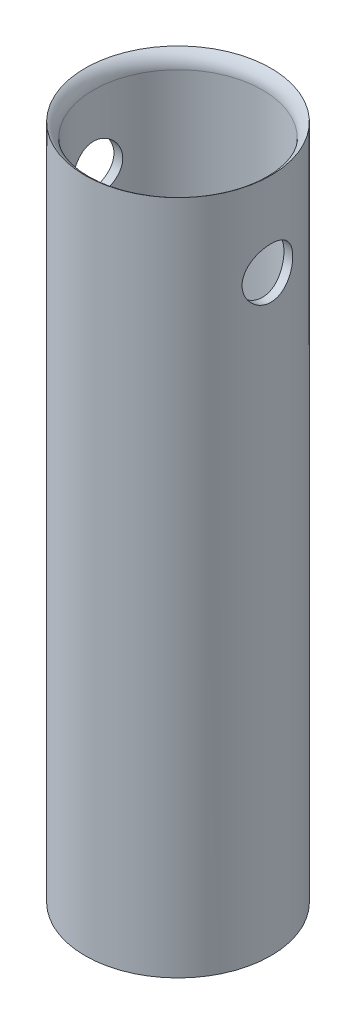
ISO-10303-21;
HEADER;
FILE_DESCRIPTION(('STEP AP214'),'2;1');
FILE_NAME('part.step','',(''),(''),'','','');
FILE_SCHEMA(('AUTOMOTIVE_DESIGN { 1 0 10303 214 1 1 1 1 }'));
ENDSEC;
DATA;
#1=APPLICATION_CONTEXT('core data for automotive mechanical design processes');
#2=APPLICATION_PROTOCOL_DEFINITION('international standard','automotive_design',2000,#1);
#3=PRODUCT_CONTEXT('',#1,'mechanical');
#4=PRODUCT('Part','Part','',(#3));
#5=PRODUCT_RELATED_PRODUCT_CATEGORY('part','',(#4));
#6=PRODUCT_DEFINITION_FORMATION('','',#4);
#7=PRODUCT_DEFINITION_CONTEXT('part definition',#1,'design');
#8=PRODUCT_DEFINITION('design','',#6,#7);
#9=PRODUCT_DEFINITION_SHAPE('','',#8);
#10=(LENGTH_UNIT() NAMED_UNIT(*) SI_UNIT(.MILLI.,.METRE.));
#11=(NAMED_UNIT(*) PLANE_ANGLE_UNIT() SI_UNIT($,.RADIAN.));
#12=(NAMED_UNIT(*) SI_UNIT($,.STERADIAN.) SOLID_ANGLE_UNIT());
#13=UNCERTAINTY_MEASURE_WITH_UNIT(LENGTH_MEASURE(1.E-05),#10,'distance_accuracy_value','');
#14=(GEOMETRIC_REPRESENTATION_CONTEXT(3) GLOBAL_UNCERTAINTY_ASSIGNED_CONTEXT((#13)) GLOBAL_UNIT_ASSIGNED_CONTEXT((#10,
#11,#12)) REPRESENTATION_CONTEXT('',''));
#15=CARTESIAN_POINT('',(0.,0.,0.));
#16=DIRECTION('',(0.,0.,1.));
#17=DIRECTION('',(1.,0.,0.));
#18=AXIS2_PLACEMENT_3D('',#15,#16,#17);
#19=CARTESIAN_POINT('',(0.,40.,0.));
#20=DIRECTION('',(0.,-1.,0.));
#21=DIRECTION('',(0.,0.,-1.));
#22=AXIS2_PLACEMENT_3D('',#19,#20,#21);
#23=CYLINDRICAL_SURFACE('',#22,5.5);
#24=CARTESIAN_POINT('',(-5.5,33.5,0.));
#25=CARTESIAN_POINT('',(-5.49999882717412,33.500001812611,-0.0826209133321938));
#26=CARTESIAN_POINT('',(-5.49812007260761,33.5068490635834,-0.165260978812708));
#27=CARTESIAN_POINT('',(-5.49080798085451,33.5340058303032,-0.328155930157698));
#28=CARTESIAN_POINT('',(-5.48537304740499,33.5543213916286,-0.408409727977266));
#29=CARTESIAN_POINT('',(-5.47154772174135,33.6077017317384,-0.564157626055395));
#30=CARTESIAN_POINT('',(-5.46316123869395,33.6407496526619,-0.639657866970164));
#31=CARTESIAN_POINT('',(-5.44431654412848,33.7185929326624,-0.78404449615972));
#32=CARTESIAN_POINT('',(-5.43385816956517,33.7633892163539,-0.852930363289778));
#33=CARTESIAN_POINT('',(-5.41171397042059,33.8645998364673,-0.983796947573262));
#34=CARTESIAN_POINT('',(-5.4000064149043,33.9212454408542,-1.04559512916994));
#35=CARTESIAN_POINT('',(-5.37682112935063,34.0440526360299,-1.15894293682478));
#36=CARTESIAN_POINT('',(-5.36534343055203,34.1102155104023,-1.21049117824722));
#37=CARTESIAN_POINT('',(-5.34369384163659,34.2516512475795,-1.30277794539498));
#38=CARTESIAN_POINT('',(-5.33354930058623,34.3270671449363,-1.34330426837587));
#39=CARTESIAN_POINT('',(-5.31603507411917,34.4839638281994,-1.41102916361227));
#40=CARTESIAN_POINT('',(-5.30866485085754,34.5654434348885,-1.43823031946844));
#41=CARTESIAN_POINT('',(-5.2977584719274,34.7301278950125,-1.47789456441268));
#42=CARTESIAN_POINT('',(-5.29413612283787,34.8132469481619,-1.49068960543229));
#43=CARTESIAN_POINT('',(-5.29087829084083,34.9805246830088,-1.50221364409134));
#44=CARTESIAN_POINT('',(-5.2912420257326,35.0646831575,-1.50094540140882));
#45=CARTESIAN_POINT('',(-5.29583824875455,35.2290415509663,-1.48464191780301));
#46=CARTESIAN_POINT('',(-5.29995718313671,35.3092852346022,-1.47001073668932));
#47=CARTESIAN_POINT('',(-5.31141755794059,35.4661332860228,-1.42804483871807));
#48=CARTESIAN_POINT('',(-5.31875926644153,35.5427373504663,-1.40070906504647));
#49=CARTESIAN_POINT('',(-5.33593618292326,35.6911735205475,-1.3337862982647));
#50=CARTESIAN_POINT('',(-5.34579959764141,35.7629392010336,-1.29405951882947));
#51=CARTESIAN_POINT('',(-5.36689368797792,35.8989264474097,-1.20357988022174));
#52=CARTESIAN_POINT('',(-5.37812464363249,35.9631464628388,-1.15282476106209));
#53=CARTESIAN_POINT('',(-5.40115894990605,36.0845251898064,-1.03967346682896));
#54=CARTESIAN_POINT('',(-5.41296874297114,36.1413674492889,-0.976938646167248));
#55=CARTESIAN_POINT('',(-5.43548647707979,36.2437909649778,-0.842682011788634));
#56=CARTESIAN_POINT('',(-5.44619437064292,36.2893717360496,-0.771159819718553));
#57=CARTESIAN_POINT('',(-5.46537278121261,36.3681266727749,-0.620853953739625));
#58=CARTESIAN_POINT('',(-5.47383251287305,36.401241338584,-0.542037637417774));
#59=CARTESIAN_POINT('',(-5.48748356142612,36.4536579725141,-0.379672688714391));
#60=CARTESIAN_POINT('',(-5.49267562644564,36.4729631024441,-0.296125144317683));
#61=CARTESIAN_POINT('',(-5.49909228776313,36.496710617797,-0.129368170483251));
#62=CARTESIAN_POINT('',(-5.50043163125371,36.5015829953204,-0.0462242977839799));
#63=CARTESIAN_POINT('',(-5.49932301585136,36.4975172524866,0.119693365637973));
#64=CARTESIAN_POINT('',(-5.49687546782998,36.4885806303835,0.202467195532508));
#65=CARTESIAN_POINT('',(-5.48854239265957,36.4575024972969,0.363745097739557));
#66=CARTESIAN_POINT('',(-5.48271986472129,36.435602807243,0.442299324272677));
#67=CARTESIAN_POINT('',(-5.46829923535645,36.3795027553595,0.594609867448631));
#68=CARTESIAN_POINT('',(-5.45970082634473,36.3453010303387,0.668365651304997));
#69=CARTESIAN_POINT('',(-5.44041573828275,36.2647835577143,0.810641161194591));
#70=CARTESIAN_POINT('',(-5.4296902954988,36.2182365127385,0.879024602412584));
#71=CARTESIAN_POINT('',(-5.40738988410034,36.1146387124548,1.00716022013082));
#72=CARTESIAN_POINT('',(-5.39581474001048,36.0575857838425,1.06691060617763));
#73=CARTESIAN_POINT('',(-5.37269401558495,35.9325859619651,1.17791060344313));
#74=CARTESIAN_POINT('',(-5.36115944983885,35.864366617721,1.22885627747222));
#75=CARTESIAN_POINT('',(-5.33980026187814,35.7201013527808,1.3185858220796));
#76=CARTESIAN_POINT('',(-5.32997557125461,35.6440557453925,1.35737017925923));
#77=CARTESIAN_POINT('',(-5.31326248703816,35.486659371758,1.42138558317209));
#78=CARTESIAN_POINT('',(-5.30635748202252,35.4053417394748,1.44669352306985));
#79=CARTESIAN_POINT('',(-5.29626814696188,35.2393831619724,1.48320917220692));
#80=CARTESIAN_POINT('',(-5.29308281231875,35.1547431204463,1.49442068863148));
#81=CARTESIAN_POINT('',(-5.29088009671763,34.9876615961825,1.50219895576908));
#82=CARTESIAN_POINT('',(-5.29172336001588,34.9052444112775,1.49925533217026));
#83=CARTESIAN_POINT('',(-5.29715501736986,34.742129352265,1.47994837643976));
#84=CARTESIAN_POINT('',(-5.30174330649891,34.661431430053,1.46358542028567));
#85=CARTESIAN_POINT('',(-5.31406316491799,34.5046936842239,1.41819408435119));
#86=CARTESIAN_POINT('',(-5.32176783125817,34.4286202467582,1.38927395449127));
#87=CARTESIAN_POINT('',(-5.33945189987964,34.2823467231867,1.31967304541385));
#88=CARTESIAN_POINT('',(-5.34943167369227,34.2121475989348,1.27899034504456));
#89=CARTESIAN_POINT('',(-5.37092379381814,34.0772894023074,1.18555430984851));
#90=CARTESIAN_POINT('',(-5.38247375845259,34.0128662951569,1.13246901822125));
#91=CARTESIAN_POINT('',(-5.40559990490855,33.8936835932054,1.01636011199274));
#92=CARTESIAN_POINT('',(-5.41717609247304,33.8389263759947,0.953334059387992));
#93=CARTESIAN_POINT('',(-5.43936459177359,33.7394053854806,0.817407725686076));
#94=CARTESIAN_POINT('',(-5.44994907753807,33.694896519133,0.744315866262518));
#95=CARTESIAN_POINT('',(-5.46865263780403,33.6188675637885,0.591399899839278));
#96=CARTESIAN_POINT('',(-5.47677322151197,33.5873395194457,0.511579952421219));
#97=CARTESIAN_POINT('',(-5.48864193995757,33.542060490021,0.360100101218209));
#98=CARTESIAN_POINT('',(-5.49286947681091,33.5263254487583,0.289064640262467));
#99=CARTESIAN_POINT('',(-5.49854887164354,33.5052949746812,0.145357607941483));
#100=CARTESIAN_POINT('',(-5.5000010318002,33.4999984053452,0.0726862155649465));
#101=CARTESIAN_POINT('',(-5.5,33.5,0.));
#102=B_SPLINE_CURVE_WITH_KNOTS('',3,(#24,#25,#26,#27,#28,#29,#30,#31,#32,#33,#34,#35,#36,#37,
#38,#39,#40,#41,#42,#43,#44,#45,#46,#47,#48,#49,#50,#51,#52,#53,#54,#55,#56,#57,#58,#59,#60,#61,
#62,#63,#64,#65,#66,#67,#68,#69,#70,#71,#72,#73,#74,#75,#76,#77,#78,#79,#80,#81,#82,#83,#84,#85,
#86,#87,#88,#89,#90,#91,#92,#93,#94,#95,#96,#97,#98,#99,#100,#101),.UNSPECIFIED.,.T.,.F.,(4,2,2,
2,2,2,2,2,2,2,2,2,2,2,2,2,2,2,2,2,2,2,2,2,2,2,2,2,2,2,2,2,2,2,2,2,2,2,4),(0.,0.247596106854898,
0.495303428551301,0.742683902420579,0.990083851364708,1.24285878223179,1.49566783659324,
1.75304593650219,2.01037411390996,2.26164304860926,2.51286267696538,2.75672886674887,
3.00061534583718,3.24735926767928,3.49415380139122,3.74938528550775,4.00462776284424,
4.26107349736029,4.51746049766944,4.76612811343083,5.01476875105251,5.25891111200195,
5.50308053475837,5.75219469009681,6.00136043656004,6.2579007306487,6.51443075867912,
6.76948096455405,7.02446227124211,7.27068852228631,7.51690787489589,7.76104555655818,
8.00522313517587,8.25689011392092,8.50861891104975,8.76605872289059,9.02334052607437,
9.2411883209319,9.45901239561305),.UNSPECIFIED.);
#103=CARTESIAN_POINT('',(-5.5,33.5,0.));
#104=VERTEX_POINT('',#103);
#105=EDGE_CURVE('E85',#104,#104,#102,.T.);
#106=ORIENTED_EDGE('',*,*,#105,.T.);
#107=EDGE_LOOP('',(#106));
#108=FACE_BOUND('',#107,.T.);
#109=CARTESIAN_POINT('',(5.29150262212918,35.,-1.5));
#110=CARTESIAN_POINT('',(5.29150397933242,34.9174435489723,-1.4999981569703));
#111=CARTESIAN_POINT('',(5.29345578048323,34.8348678900445,-1.49316121586719));
#112=CARTESIAN_POINT('',(5.3010274190552,34.6721064747,-1.46604910592423));
#113=CARTESIAN_POINT('',(5.30664898703923,34.5919218645015,-1.44576759691971));
#114=CARTESIAN_POINT('',(5.32087717395131,34.4363208120382,-1.39248674622751));
#115=CARTESIAN_POINT('',(5.32947946238205,34.3608976390958,-1.35950584697685));
#116=CARTESIAN_POINT('',(5.34869425130277,34.2166418657633,-1.28182074023251));
#117=CARTESIAN_POINT('',(5.35930693404948,34.1478098637627,-1.23711546969878));
#118=CARTESIAN_POINT('',(5.38165786345274,34.0168897932087,-1.13599985857016));
#119=CARTESIAN_POINT('',(5.39341679089298,33.954999671622,-1.07933774218464));
#120=CARTESIAN_POINT('',(5.41655710292429,33.8414723422745,-0.956458027204654));
#121=CARTESIAN_POINT('',(5.4279384467319,33.789836239084,-0.890239400501257));
#122=CARTESIAN_POINT('',(5.44927272086847,33.6974513731895,-0.748747592415014));
#123=CARTESIAN_POINT('',(5.45919841481043,33.6569002781736,-0.673340883118101));
#124=CARTESIAN_POINT('',(5.4762652255866,33.5891271318171,-0.516463712056493));
#125=CARTESIAN_POINT('',(5.48340683437022,33.5619027254258,-0.434994324603005));
#126=CARTESIAN_POINT('',(5.49395456075485,33.5221989017195,-0.270371451848025));
#127=CARTESIAN_POINT('',(5.4974458959785,33.5093825557853,-0.187304783419293));
#128=CARTESIAN_POINT('',(5.50059802264474,33.497797697702,-0.0201318714747487));
#129=CARTESIAN_POINT('',(5.50025948354,33.4990267304555,0.0639741877907305));
#130=CARTESIAN_POINT('',(5.49585206403333,33.5152623986484,0.228490060702588));
#131=CARTESIAN_POINT('',(5.49188178563756,33.5299048733193,0.308938859429588));
#132=CARTESIAN_POINT('',(5.48077394096948,33.5719623323456,0.466191004896714));
#133=CARTESIAN_POINT('',(5.47363619004791,33.5993780613283,0.542994138822177));
#134=CARTESIAN_POINT('',(5.45685088879515,33.666477135843,0.691693236894895));
#135=CARTESIAN_POINT('',(5.44717834180867,33.7062834486877,0.763530775491582));
#136=CARTESIAN_POINT('',(5.4263628785745,33.7969388942674,0.899629268660998));
#137=CARTESIAN_POINT('',(5.41521966459728,33.8477902643713,0.963888684077534));
#138=CARTESIAN_POINT('',(5.39224620796906,33.9610179951209,1.08518074875882));
#139=CARTESIAN_POINT('',(5.38040539296798,34.0237116719408,1.14191553261874));
#140=CARTESIAN_POINT('',(5.35769198772825,34.1578452151133,1.24414076282169));
#141=CARTESIAN_POINT('',(5.34681946230361,34.2292856661864,1.28963045681796));
#142=CARTESIAN_POINT('',(5.32722971617593,34.3795543940004,1.36831504906637));
#143=CARTESIAN_POINT('',(5.31852743967169,34.4584290057742,1.40142544272702));
#144=CARTESIAN_POINT('',(5.30444735453973,34.6209226022291,1.45381649809065));
#145=CARTESIAN_POINT('',(5.29906867769276,34.7045403416328,1.47310077178258));
#146=CARTESIAN_POINT('',(5.29243075183376,34.87135218151,1.49677126460125));
#147=CARTESIAN_POINT('',(5.29104827888985,34.9544781867641,1.50160329063472));
#148=CARTESIAN_POINT('',(5.29222151202243,35.1203511435421,1.49746332611022));
#149=CARTESIAN_POINT('',(5.29477677694071,35.2030981364863,1.48849288189024));
#150=CARTESIAN_POINT('',(5.30341820279288,35.3641224373114,1.45739637961775));
#151=CARTESIAN_POINT('',(5.3094315020934,35.4424564206298,1.43554156609381));
#152=CARTESIAN_POINT('',(5.32423951436502,35.5943460099306,1.37960331838531));
#153=CARTESIAN_POINT('',(5.33303460273288,35.6679009693777,1.34551823366713));
#154=CARTESIAN_POINT('',(5.3526656797527,35.810000708167,1.26519240779034));
#155=CARTESIAN_POINT('',(5.36354371589181,35.878392574505,1.21869167395158));
#156=CARTESIAN_POINT('',(5.3860176273416,36.0065660653851,1.11517441622706));
#157=CARTESIAN_POINT('',(5.39761364372337,36.0663459901001,1.05815582137422));
#158=CARTESIAN_POINT('',(5.42064365021152,36.1774663639506,0.933153363001186));
#159=CARTESIAN_POINT('',(5.43206199790196,36.2284950034342,0.8648888475196));
#160=CARTESIAN_POINT('',(5.45308956662174,36.318370635091,0.720505557506887));
#161=CARTESIAN_POINT('',(5.46269888388575,36.3572182753278,0.644387201108798));
#162=CARTESIAN_POINT('',(5.47896373225224,36.4212670662579,0.486992338151911));
#163=CARTESIAN_POINT('',(5.48564141597945,36.4465708903005,0.405760013245425));
#164=CARTESIAN_POINT('',(5.49538823820121,36.4831069525451,0.239985864722819));
#165=CARTESIAN_POINT('',(5.4984582160406,36.4943424638269,0.155444815623817));
#166=CARTESIAN_POINT('',(5.50060207356917,36.5022101200906,-0.0116397196820228));
#167=CARTESIAN_POINT('',(5.49980084994582,36.4992986713067,-0.094160409305192));
#168=CARTESIAN_POINT('',(5.4945768528746,36.48002022269,-0.257491304637166));
#169=CARTESIAN_POINT('',(5.49015422670854,36.4636537700697,-0.338301579771118));
#170=CARTESIAN_POINT('',(5.47821112917835,36.4181926296605,-0.49534203369685));
#171=CARTESIAN_POINT('',(5.47071413494114,36.3891943017598,-0.571602011794993));
#172=CARTESIAN_POINT('',(5.45340440920124,36.3193783784649,-0.718217369622537));
#173=CARTESIAN_POINT('',(5.44359134174256,36.2785590681934,-0.788571890732096));
#174=CARTESIAN_POINT('',(5.42235787347661,36.1849452717183,-0.923488675195431));
#175=CARTESIAN_POINT('',(5.41090053751388,36.1318509275634,-0.987837043212874));
#176=CARTESIAN_POINT('',(5.38781343748961,36.0157578614498,-1.10686496193089));
#177=CARTESIAN_POINT('',(5.37618362817694,35.9527564970487,-1.16154192474211));
#178=CARTESIAN_POINT('',(5.35375507792812,35.8168724731691,-1.2609396606189));
#179=CARTESIAN_POINT('',(5.34298201162846,35.7437937973192,-1.30539879787935));
#180=CARTESIAN_POINT('',(5.32385655741428,35.5909140548504,-1.38133806303029));
#181=CARTESIAN_POINT('',(5.31550265682104,35.5111172294897,-1.41282630671052));
#182=CARTESIAN_POINT('',(5.30326481572331,35.3597319807474,-1.45802611152119));
#183=CARTESIAN_POINT('',(5.29889066810921,35.2887715312485,-1.47372831222931));
#184=CARTESIAN_POINT('',(5.29300915582115,35.1452122020973,-1.494715407894));
#185=CARTESIAN_POINT('',(5.29150142838456,35.0726135309487,-1.5000016210592));
#186=CARTESIAN_POINT('',(5.29150262212918,35.,-1.5));
#187=B_SPLINE_CURVE_WITH_KNOTS('',3,(#109,#110,#111,#112,#113,#114,#115,#116,#117,#118,#119,
#120,#121,#122,#123,#124,#125,#126,#127,#128,#129,#130,#131,#132,#133,#134,#135,#136,#137,#138,
#139,#140,#141,#142,#143,#144,#145,#146,#147,#148,#149,#150,#151,#152,#153,#154,#155,#156,#157,
#158,#159,#160,#161,#162,#163,#164,#165,#166,#167,#168,#169,#170,#171,#172,#173,#174,#175,#176,
#177,#178,#179,#180,#181,#182,#183,#184,#185,#186),.UNSPECIFIED.,.T.,.F.,(4,2,2,2,2,2,2,2,2,2,2,
2,2,2,2,2,2,2,2,2,2,2,2,2,2,2,2,2,2,2,2,2,2,2,2,2,2,2,4),(0.,0.247402201391972,
0.494921155336744,0.742082002291407,0.989265266888853,1.24229327000825,1.49534851471804,
1.75265882819585,2.00992365416646,2.26103843021061,2.51210931268385,2.75655962385664,
3.0010241872433,3.24799669713117,3.49501928234234,3.74996416866223,4.00492610732058,
4.26159801830626,4.51820285087414,4.76680611540842,5.01538153009582,5.25890187447337,
5.50245509545498,5.75157425489228,6.00074251835821,6.25748556676549,6.51421495339718,
6.76896951768223,7.02366480072505,7.27019876040454,7.51672269408902,7.76139812559489,
8.00610907011738,8.25758505394755,8.50912822664455,8.76653181226182,9.02377409687475,
9.24140725781327,9.45901287413893),.UNSPECIFIED.);
#188=CARTESIAN_POINT('',(5.29150262212918,35.,-1.5));
#189=VERTEX_POINT('',#188);
#190=EDGE_CURVE('E80',#189,#189,#187,.T.);
#191=ORIENTED_EDGE('',*,*,#190,.T.);
#192=EDGE_LOOP('',(#191));
#193=FACE_BOUND('',#192,.T.);
#194=CARTESIAN_POINT('',(0.,40.,0.));
#195=DIRECTION('',(0.,1.,0.));
#196=DIRECTION('',(0.,0.,1.));
#197=AXIS2_PLACEMENT_3D('',#194,#195,#196);
#198=CIRCLE('',#197,5.5);
#199=CARTESIAN_POINT('',(0.,40.,5.5));
#200=VERTEX_POINT('',#199);
#201=EDGE_CURVE('E59',#200,#200,#198,.T.);
#202=ORIENTED_EDGE('',*,*,#201,.F.);
#203=EDGE_LOOP('',(#202));
#204=FACE_BOUND('',#203,.T.);
#205=CARTESIAN_POINT('',(0.,0.,0.));
#206=DIRECTION('',(0.,1.,0.));
#207=DIRECTION('',(0.,0.,1.));
#208=AXIS2_PLACEMENT_3D('',#205,#206,#207);
#209=CIRCLE('',#208,5.5);
#210=CARTESIAN_POINT('',(0.,0.,5.5));
#211=VERTEX_POINT('',#210);
#212=EDGE_CURVE('E109',#211,#211,#209,.T.);
#213=ORIENTED_EDGE('',*,*,#212,.T.);
#214=EDGE_LOOP('',(#213));
#215=FACE_BOUND('',#214,.T.);
#216=ADVANCED_FACE('F41',(#108,#193,#204,#215),#23,.T.);
#217=CARTESIAN_POINT('',(0.,40.,0.));
#218=DIRECTION('',(0.,-1.,0.));
#219=DIRECTION('',(0.,0.,-1.));
#220=AXIS2_PLACEMENT_3D('',#217,#218,#219);
#221=CYLINDRICAL_SURFACE('',#220,5.);
#222=CARTESIAN_POINT('',(-4.76969600708473,35.,-1.5));
#223=CARTESIAN_POINT('',(-4.7696968572698,35.0821945479424,-1.49999897633764));
#224=CARTESIAN_POINT('',(-4.77184390209069,35.164399224144,-1.49322108167142));
#225=CARTESIAN_POINT('',(-4.780165783029,35.3264052495919,-1.46635844446749));
#226=CARTESIAN_POINT('',(-4.78634196493468,35.4062057865015,-1.44626925573578));
#227=CARTESIAN_POINT('',(-4.80196102485632,35.5610347282717,-1.39352753269955));
#228=CARTESIAN_POINT('',(-4.81139846703232,35.6360708296331,-1.36089589394243));
#229=CARTESIAN_POINT('',(-4.83246932547567,35.7796219339953,-1.28406421917929));
#230=CARTESIAN_POINT('',(-4.84410307041019,35.8481359586844,-1.23986245137053));
#231=CARTESIAN_POINT('',(-4.86866862185765,35.9788663905774,-1.13964754141627));
#232=CARTESIAN_POINT('',(-4.88162808311635,36.0408458979463,-1.08333207175807));
#233=CARTESIAN_POINT('',(-4.90714861936757,36.1546379513225,-0.9611362375796));
#234=CARTESIAN_POINT('',(-4.91970964297705,36.2064491904499,-0.895254645461112));
#235=CARTESIAN_POINT('',(-4.94333214579389,36.2994626998333,-0.75411143779369));
#236=CARTESIAN_POINT('',(-4.95435724342404,36.3404234244428,-0.678684021335814));
#237=CARTESIAN_POINT('',(-4.97334435920684,36.4089872590428,-0.521624645369353));
#238=CARTESIAN_POINT('',(-4.98130703789495,36.4365932498575,-0.439994028387912));
#239=CARTESIAN_POINT('',(-4.99307646003589,36.4768800010905,-0.27532385263083));
#240=CARTESIAN_POINT('',(-4.99699557369338,36.4899651276527,-0.192391398953801));
#241=CARTESIAN_POINT('',(-5.00063201501348,36.5021173246464,-0.025421823749314));
#242=CARTESIAN_POINT('',(-5.00035022521079,36.501187339402,0.0586150620503696));
#243=CARTESIAN_POINT('',(-4.99569603817658,36.485607131457,0.222571156600162));
#244=CARTESIAN_POINT('',(-4.9914542020526,36.4713948061901,0.302536267641343));
#245=CARTESIAN_POINT('',(-4.97951522112593,36.4303686640057,0.458889213442527));
#246=CARTESIAN_POINT('',(-4.97181785750586,36.4035540490573,0.535276821322846));
#247=CARTESIAN_POINT('',(-4.95365220986963,36.3377879765814,0.683347326351282));
#248=CARTESIAN_POINT('',(-4.94315269676706,36.2986987971927,0.754965064694479));
#249=CARTESIAN_POINT('',(-4.92049640648069,36.2096021475718,0.890764673783157));
#250=CARTESIAN_POINT('',(-4.90833923637778,36.1595920870365,0.954944774872132));
#251=CARTESIAN_POINT('',(-4.88311550488165,36.0478022492484,1.0766604815298));
#252=CARTESIAN_POINT('',(-4.87003195321461,35.9856430809703,1.13384458040112));
#253=CARTESIAN_POINT('',(-4.84483979887497,35.85248998211,1.23707651539824));
#254=CARTESIAN_POINT('',(-4.8327312931702,35.7814951746108,1.28312324482852));
#255=CARTESIAN_POINT('',(-4.81077903197678,35.631760530751,1.3631399533545));
#256=CARTESIAN_POINT('',(-4.80095810695956,35.5529529541371,1.39698989237679));
#257=CARTESIAN_POINT('',(-4.78496392548436,35.3903927915545,1.45083362878413));
#258=CARTESIAN_POINT('',(-4.7787894791583,35.3066418284655,1.4708319464056));
#259=CARTESIAN_POINT('',(-4.77104849541241,35.1399176392607,1.49574770282165));
#260=CARTESIAN_POINT('',(-4.7693187867044,35.057031776106,1.50119946380212));
#261=CARTESIAN_POINT('',(-4.77021192441924,34.8915270999901,1.49835947233062));
#262=CARTESIAN_POINT('',(-4.77283416156589,34.8089082512692,1.4900696437133));
#263=CARTESIAN_POINT('',(-4.78197558554912,34.6485116220291,1.4604576357419));
#264=CARTESIAN_POINT('',(-4.78839176507489,34.5706638357365,1.4394796143128));
#265=CARTESIAN_POINT('',(-4.80429141231227,34.4195983091851,1.3854857774794));
#266=CARTESIAN_POINT('',(-4.81377535359073,34.3463812858594,1.3524681034276));
#267=CARTESIAN_POINT('',(-4.83505835023047,34.2044825359279,1.27431871196501));
#268=CARTESIAN_POINT('',(-4.84691271069798,34.1359752790142,1.22888564172729));
#269=CARTESIAN_POINT('',(-4.87148205646987,34.0073618938192,1.12755301600385));
#270=CARTESIAN_POINT('',(-4.88419724730003,33.9472577823872,1.07165095534897));
#271=CARTESIAN_POINT('',(-4.90963633548158,33.8348195941853,0.948455132493601));
#272=CARTESIAN_POINT('',(-4.92234245063004,33.782864371013,0.880811065857436));
#273=CARTESIAN_POINT('',(-4.9458485174865,33.6910332989723,0.73746178459025));
#274=CARTESIAN_POINT('',(-4.95664856384717,33.6511568502185,0.661756970543944));
#275=CARTESIAN_POINT('',(-4.97505970474957,33.5849999694317,0.504935504705221));
#276=CARTESIAN_POINT('',(-4.98269453424965,33.558617983841,0.423864622037839));
#277=CARTESIAN_POINT('',(-4.99401979596827,33.5199390811096,0.258169966504588));
#278=CARTESIAN_POINT('',(-4.9977113567088,33.5076381340516,0.173547217354763));
#279=CARTESIAN_POINT('',(-5.00066544081399,33.4977769559455,0.00665215388274271));
#280=CARTESIAN_POINT('',(-5.00009305111322,33.4996673045922,-0.0755851790862071));
#281=CARTESIAN_POINT('',(-4.99497264465036,33.5168216324991,-0.238519481164404));
#282=CARTESIAN_POINT('',(-4.99042485330462,33.5320848534804,-0.319216537346529));
#283=CARTESIAN_POINT('',(-4.97791168358326,33.5752116613996,-0.475935813041359));
#284=CARTESIAN_POINT('',(-4.96998352900866,33.602938180649,-0.551998927351393));
#285=CARTESIAN_POINT('',(-4.9515294303945,33.6700819145072,-0.698433237752054));
#286=CARTESIAN_POINT('',(-4.94100305949946,33.7095010502862,-0.76880349605058));
#287=CARTESIAN_POINT('',(-4.91803965828228,33.80037345743,-0.904301892420565));
#288=CARTESIAN_POINT('',(-4.90555226923559,33.8521714300008,-0.969190250076771));
#289=CARTESIAN_POINT('',(-4.88023537212334,33.9657103883328,-1.08953757134595));
#290=CARTESIAN_POINT('',(-4.86740576641079,34.0274542378982,-1.14499380960194));
#291=CARTESIAN_POINT('',(-4.84240680631319,34.1613407783105,-1.24656269394549));
#292=CARTESIAN_POINT('',(-4.83026852693485,34.2337385533904,-1.29234759757956));
#293=CARTESIAN_POINT('',(-4.80852547508793,34.385555174161,-1.37104313528776));
#294=CARTESIAN_POINT('',(-4.79891948596955,34.4649706236012,-1.40395995557289));
#295=CARTESIAN_POINT('',(-4.78427816717594,34.6197404316063,-1.45301942532949));
#296=CARTESIAN_POINT('',(-4.7788615484052,34.694608646931,-1.47058859011231));
#297=CARTESIAN_POINT('',(-4.77157042597167,34.8463152224958,-1.49407818835144));
#298=CARTESIAN_POINT('',(-4.7696952122143,34.9231531846453,-1.50000095706095));
#299=CARTESIAN_POINT('',(-4.76969600708473,35.,-1.5));
#300=B_SPLINE_CURVE_WITH_KNOTS('',3,(#222,#223,#224,#225,#226,#227,#228,#229,#230,#231,#232,
#233,#234,#235,#236,#237,#238,#239,#240,#241,#242,#243,#244,#245,#246,#247,#248,#249,#250,#251,
#252,#253,#254,#255,#256,#257,#258,#259,#260,#261,#262,#263,#264,#265,#266,#267,#268,#269,#270,
#271,#272,#273,#274,#275,#276,#277,#278,#279,#280,#281,#282,#283,#284,#285,#286,#287,#288,#289,
#290,#291,#292,#293,#294,#295,#296,#297,#298,#299),.UNSPECIFIED.,.T.,.F.,(4,2,2,2,2,2,2,2,2,2,2,
2,2,2,2,2,2,2,2,2,2,2,2,2,2,2,2,2,2,2,2,2,2,2,2,2,2,2,4),(0.,0.246300165915542,
0.492682641689001,0.738656414466191,0.984667025370097,1.23773150007984,1.49082847871273,
1.74915939273645,2.00743455587877,2.25832140149558,2.50915554101441,2.7520012599088,
2.99486235890376,3.24055209335676,3.48630016590831,3.74152147023278,3.99676812491863,
4.25446238246266,4.51207250628411,4.76008080790309,5.00805439107388,5.24958594938817,
5.49115481045787,5.73920731809388,5.98731925928923,6.24479506100602,6.50225807324202,
6.75775391814325,7.01317662321682,7.2587630391122,7.50433553047755,7.74727096872219,
7.99024634491378,8.24099627054489,8.49181852629891,8.75011639669147,9.00828993963944,
9.23861153857447,9.4688869503356),.UNSPECIFIED.);
#301=CARTESIAN_POINT('',(-4.76969600708473,35.,-1.5));
#302=VERTEX_POINT('',#301);
#303=EDGE_CURVE('E45',#302,#302,#300,.T.);
#304=ORIENTED_EDGE('',*,*,#303,.F.);
#305=EDGE_LOOP('',(#304));
#306=FACE_BOUND('',#305,.T.);
#307=CARTESIAN_POINT('',(4.76969600708473,35.,-1.5));
#308=CARTESIAN_POINT('',(4.7696968572698,34.9178054520576,-1.49999897633764));
#309=CARTESIAN_POINT('',(4.77184390209069,34.835600775856,-1.49322108167142));
#310=CARTESIAN_POINT('',(4.780165783029,34.6735947504081,-1.46635844446749));
#311=CARTESIAN_POINT('',(4.78634196493468,34.5937942134985,-1.44626925573578));
#312=CARTESIAN_POINT('',(4.80196102485632,34.4389652717283,-1.39352753269955));
#313=CARTESIAN_POINT('',(4.81139846703232,34.3639291703669,-1.36089589394243));
#314=CARTESIAN_POINT('',(4.83246932547567,34.2203780660047,-1.28406421917929));
#315=CARTESIAN_POINT('',(4.84410307041019,34.1518640413156,-1.23986245137053));
#316=CARTESIAN_POINT('',(4.86866862185765,34.0211336094226,-1.13964754141627));
#317=CARTESIAN_POINT('',(4.88162808311635,33.9591541020537,-1.08333207175807));
#318=CARTESIAN_POINT('',(4.90714861936757,33.8453620486775,-0.9611362375796));
#319=CARTESIAN_POINT('',(4.91970964297705,33.7935508095501,-0.895254645461112));
#320=CARTESIAN_POINT('',(4.94333214579389,33.7005373001667,-0.75411143779369));
#321=CARTESIAN_POINT('',(4.95435724342404,33.6595765755572,-0.678684021335814));
#322=CARTESIAN_POINT('',(4.97334435920684,33.5910127409572,-0.521624645369353));
#323=CARTESIAN_POINT('',(4.98130703789495,33.5634067501425,-0.439994028387912));
#324=CARTESIAN_POINT('',(4.99307646003589,33.5231199989095,-0.27532385263083));
#325=CARTESIAN_POINT('',(4.99699557369338,33.5100348723473,-0.192391398953801));
#326=CARTESIAN_POINT('',(5.00063201501348,33.4978826753536,-0.025421823749314));
#327=CARTESIAN_POINT('',(5.00035022521079,33.498812660598,0.0586150620503696));
#328=CARTESIAN_POINT('',(4.99569603817658,33.514392868543,0.222571156600162));
#329=CARTESIAN_POINT('',(4.9914542020526,33.5286051938099,0.302536267641343));
#330=CARTESIAN_POINT('',(4.97951522112593,33.5696313359943,0.458889213442527));
#331=CARTESIAN_POINT('',(4.97181785750586,33.5964459509427,0.535276821322846));
#332=CARTESIAN_POINT('',(4.95365220986963,33.6622120234186,0.683347326351282));
#333=CARTESIAN_POINT('',(4.94315269676706,33.7013012028073,0.754965064694479));
#334=CARTESIAN_POINT('',(4.92049640648069,33.7903978524282,0.890764673783157));
#335=CARTESIAN_POINT('',(4.90833923637778,33.8404079129635,0.954944774872132));
#336=CARTESIAN_POINT('',(4.88311550488165,33.9521977507516,1.0766604815298));
#337=CARTESIAN_POINT('',(4.87003195321461,34.0143569190297,1.13384458040112));
#338=CARTESIAN_POINT('',(4.84483979887497,34.1475100178901,1.23707651539824));
#339=CARTESIAN_POINT('',(4.8327312931702,34.2185048253892,1.28312324482852));
#340=CARTESIAN_POINT('',(4.81077903197678,34.368239469249,1.3631399533545));
#341=CARTESIAN_POINT('',(4.80095810695956,34.4470470458629,1.39698989237679));
#342=CARTESIAN_POINT('',(4.78496392548436,34.6096072084455,1.45083362878413));
#343=CARTESIAN_POINT('',(4.7787894791583,34.6933581715346,1.4708319464056));
#344=CARTESIAN_POINT('',(4.77104849541241,34.8600823607393,1.49574770282165));
#345=CARTESIAN_POINT('',(4.7693187867044,34.942968223894,1.50119946380212));
#346=CARTESIAN_POINT('',(4.77021192441924,35.1084729000099,1.49835947233062));
#347=CARTESIAN_POINT('',(4.77283416156589,35.1910917487308,1.4900696437133));
#348=CARTESIAN_POINT('',(4.78197558554912,35.3514883779709,1.4604576357419));
#349=CARTESIAN_POINT('',(4.78839176507489,35.4293361642635,1.4394796143128));
#350=CARTESIAN_POINT('',(4.80429141231227,35.5804016908149,1.3854857774794));
#351=CARTESIAN_POINT('',(4.81377535359073,35.6536187141406,1.3524681034276));
#352=CARTESIAN_POINT('',(4.83505835023047,35.7955174640721,1.27431871196501));
#353=CARTESIAN_POINT('',(4.84691271069798,35.8640247209858,1.22888564172729));
#354=CARTESIAN_POINT('',(4.87148205646987,35.9926381061808,1.12755301600385));
#355=CARTESIAN_POINT('',(4.88419724730003,36.0527422176128,1.07165095534897));
#356=CARTESIAN_POINT('',(4.90963633548158,36.1651804058147,0.948455132493601));
#357=CARTESIAN_POINT('',(4.92234245063004,36.217135628987,0.880811065857436));
#358=CARTESIAN_POINT('',(4.9458485174865,36.3089667010278,0.73746178459025));
#359=CARTESIAN_POINT('',(4.95664856384717,36.3488431497815,0.661756970543944));
#360=CARTESIAN_POINT('',(4.97505970474957,36.4150000305683,0.504935504705221));
#361=CARTESIAN_POINT('',(4.98269453424965,36.441382016159,0.423864622037839));
#362=CARTESIAN_POINT('',(4.99401979596827,36.4800609188904,0.258169966504588));
#363=CARTESIAN_POINT('',(4.9977113567088,36.4923618659484,0.173547217354763));
#364=CARTESIAN_POINT('',(5.00066544081399,36.5022230440545,0.00665215388274271));
#365=CARTESIAN_POINT('',(5.00009305111322,36.5003326954078,-0.0755851790862071));
#366=CARTESIAN_POINT('',(4.99497264465036,36.4831783675009,-0.238519481164404));
#367=CARTESIAN_POINT('',(4.99042485330462,36.4679151465196,-0.319216537346529));
#368=CARTESIAN_POINT('',(4.97791168358326,36.4247883386004,-0.475935813041359));
#369=CARTESIAN_POINT('',(4.96998352900866,36.397061819351,-0.551998927351393));
#370=CARTESIAN_POINT('',(4.9515294303945,36.3299180854928,-0.698433237752054));
#371=CARTESIAN_POINT('',(4.94100305949946,36.2904989497138,-0.76880349605058));
#372=CARTESIAN_POINT('',(4.91803965828228,36.19962654257,-0.904301892420565));
#373=CARTESIAN_POINT('',(4.90555226923559,36.1478285699992,-0.969190250076771));
#374=CARTESIAN_POINT('',(4.88023537212334,36.0342896116672,-1.08953757134595));
#375=CARTESIAN_POINT('',(4.86740576641079,35.9725457621018,-1.14499380960194));
#376=CARTESIAN_POINT('',(4.84240680631319,35.8386592216895,-1.24656269394549));
#377=CARTESIAN_POINT('',(4.83026852693485,35.7662614466096,-1.29234759757956));
#378=CARTESIAN_POINT('',(4.80852547508793,35.614444825839,-1.37104313528776));
#379=CARTESIAN_POINT('',(4.79891948596955,35.5350293763988,-1.40395995557289));
#380=CARTESIAN_POINT('',(4.78427816717594,35.3802595683937,-1.45301942532949));
#381=CARTESIAN_POINT('',(4.7788615484052,35.305391353069,-1.47058859011231));
#382=CARTESIAN_POINT('',(4.77157042597167,35.1536847775042,-1.49407818835144));
#383=CARTESIAN_POINT('',(4.7696952122143,35.0768468153548,-1.50000095706095));
#384=CARTESIAN_POINT('',(4.76969600708473,35.,-1.5));
#385=B_SPLINE_CURVE_WITH_KNOTS('',3,(#307,#308,#309,#310,#311,#312,#313,#314,#315,#316,#317,
#318,#319,#320,#321,#322,#323,#324,#325,#326,#327,#328,#329,#330,#331,#332,#333,#334,#335,#336,
#337,#338,#339,#340,#341,#342,#343,#344,#345,#346,#347,#348,#349,#350,#351,#352,#353,#354,#355,
#356,#357,#358,#359,#360,#361,#362,#363,#364,#365,#366,#367,#368,#369,#370,#371,#372,#373,#374,
#375,#376,#377,#378,#379,#380,#381,#382,#383,#384),.UNSPECIFIED.,.T.,.F.,(4,2,2,2,2,2,2,2,2,2,2,
2,2,2,2,2,2,2,2,2,2,2,2,2,2,2,2,2,2,2,2,2,2,2,2,2,2,2,4),(0.,0.246300165915542,
0.492682641689001,0.738656414466191,0.984667025370097,1.23773150007984,1.49082847871273,
1.74915939273645,2.00743455587877,2.25832140149558,2.50915554101441,2.7520012599088,
2.99486235890376,3.24055209335676,3.48630016590831,3.74152147023278,3.99676812491863,
4.25446238246266,4.51207250628411,4.76008080790309,5.00805439107388,5.24958594938817,
5.49115481045787,5.73920731809388,5.98731925928923,6.24479506100602,6.50225807324202,
6.75775391814325,7.01317662321682,7.2587630391122,7.50433553047755,7.74727096872219,
7.99024634491378,8.24099627054489,8.49181852629891,8.75011639669147,9.00828993963944,
9.23861153857447,9.4688869503356),.UNSPECIFIED.);
#386=CARTESIAN_POINT('',(4.76969600708473,35.,-1.5));
#387=VERTEX_POINT('',#386);
#388=EDGE_CURVE('E62',#387,#387,#385,.T.);
#389=ORIENTED_EDGE('',*,*,#388,.F.);
#390=EDGE_LOOP('',(#389));
#391=FACE_BOUND('',#390,.T.);
#392=CARTESIAN_POINT('',(0.,0.866025403784436,0.));
#393=DIRECTION('',(0.,-1.,0.));
#394=DIRECTION('',(0.,0.,-1.));
#395=AXIS2_PLACEMENT_3D('',#392,#393,#394);
#396=CIRCLE('',#395,5.);
#397=CARTESIAN_POINT('',(0.,0.866025403784436,-5.));
#398=VERTEX_POINT('',#397);
#399=EDGE_CURVE('E10',#398,#398,#396,.T.);
#400=ORIENTED_EDGE('',*,*,#399,.T.);
#401=EDGE_LOOP('',(#400));
#402=FACE_BOUND('',#401,.T.);
#403=CARTESIAN_POINT('',(0.,39.1339745962156,0.));
#404=DIRECTION('',(0.,1.,0.));
#405=DIRECTION('',(0.,0.,1.));
#406=AXIS2_PLACEMENT_3D('',#403,#404,#405);
#407=CIRCLE('',#406,5.);
#408=CARTESIAN_POINT('',(0.,39.1339745962156,5.));
#409=VERTEX_POINT('',#408);
#410=EDGE_CURVE('E54',#409,#409,#407,.T.);
#411=ORIENTED_EDGE('',*,*,#410,.T.);
#412=EDGE_LOOP('',(#411));
#413=FACE_BOUND('',#412,.T.);
#414=ADVANCED_FACE('F67',(#306,#391,#402,#413),#221,.F.);
#415=CARTESIAN_POINT('',(0.,39.1339745962156,0.));
#416=DIRECTION('',(0.,1.,0.));
#417=DIRECTION('',(0.,0.,1.));
#418=AXIS2_PLACEMENT_3D('',#415,#416,#417);
#419=TOROIDAL_SURFACE('',#418,6.,1.);
#420=ORIENTED_EDGE('',*,*,#201,.T.);
#421=EDGE_LOOP('',(#420));
#422=FACE_BOUND('',#421,.T.);
#423=ORIENTED_EDGE('',*,*,#410,.F.);
#424=EDGE_LOOP('',(#423));
#425=FACE_BOUND('',#424,.T.);
#426=ADVANCED_FACE('F93',(#422,#425),#419,.T.);
#427=CARTESIAN_POINT('',(0.,0.866025403784439,0.));
#428=DIRECTION('',(0.,-1.,0.));
#429=DIRECTION('',(0.,0.,-1.));
#430=AXIS2_PLACEMENT_3D('',#427,#428,#429);
#431=TOROIDAL_SURFACE('',#430,6.,1.);
#432=ORIENTED_EDGE('',*,*,#399,.F.);
#433=EDGE_LOOP('',(#432));
#434=FACE_BOUND('',#433,.T.);
#435=ORIENTED_EDGE('',*,*,#212,.F.);
#436=EDGE_LOOP('',(#435));
#437=FACE_BOUND('',#436,.T.);
#438=ADVANCED_FACE('F43',(#434,#437),#431,.T.);
#439=CARTESIAN_POINT('',(-5.5,35.,0.));
#440=DIRECTION('',(1.,0.,0.));
#441=DIRECTION('',(0.,0.,-1.));
#442=AXIS2_PLACEMENT_3D('',#439,#440,#441);
#443=CYLINDRICAL_SURFACE('',#442,1.5);
#444=ORIENTED_EDGE('',*,*,#388,.T.);
#445=EDGE_LOOP('',(#444));
#446=FACE_BOUND('',#445,.T.);
#447=ORIENTED_EDGE('',*,*,#190,.F.);
#448=EDGE_LOOP('',(#447));
#449=FACE_BOUND('',#448,.T.);
#450=ADVANCED_FACE('F73',(#446,#449),#443,.F.);
#451=ORIENTED_EDGE('',*,*,#303,.T.);
#452=EDGE_LOOP('',(#451));
#453=FACE_BOUND('',#452,.T.);
#454=ORIENTED_EDGE('',*,*,#105,.F.);
#455=EDGE_LOOP('',(#454));
#456=FACE_BOUND('',#455,.T.);
#457=ADVANCED_FACE('F70',(#453,#456),#443,.F.);
#458=CLOSED_SHELL('',(#216,#414,#426,#438,#450,#457));
#459=MANIFOLD_SOLID_BREP('B2',#458);
#460=ADVANCED_BREP_SHAPE_REPRESENTATION('',(#18,#459),#14);
#461=SHAPE_DEFINITION_REPRESENTATION(#9,#460);
ENDSEC;
END-ISO-10303-21;
